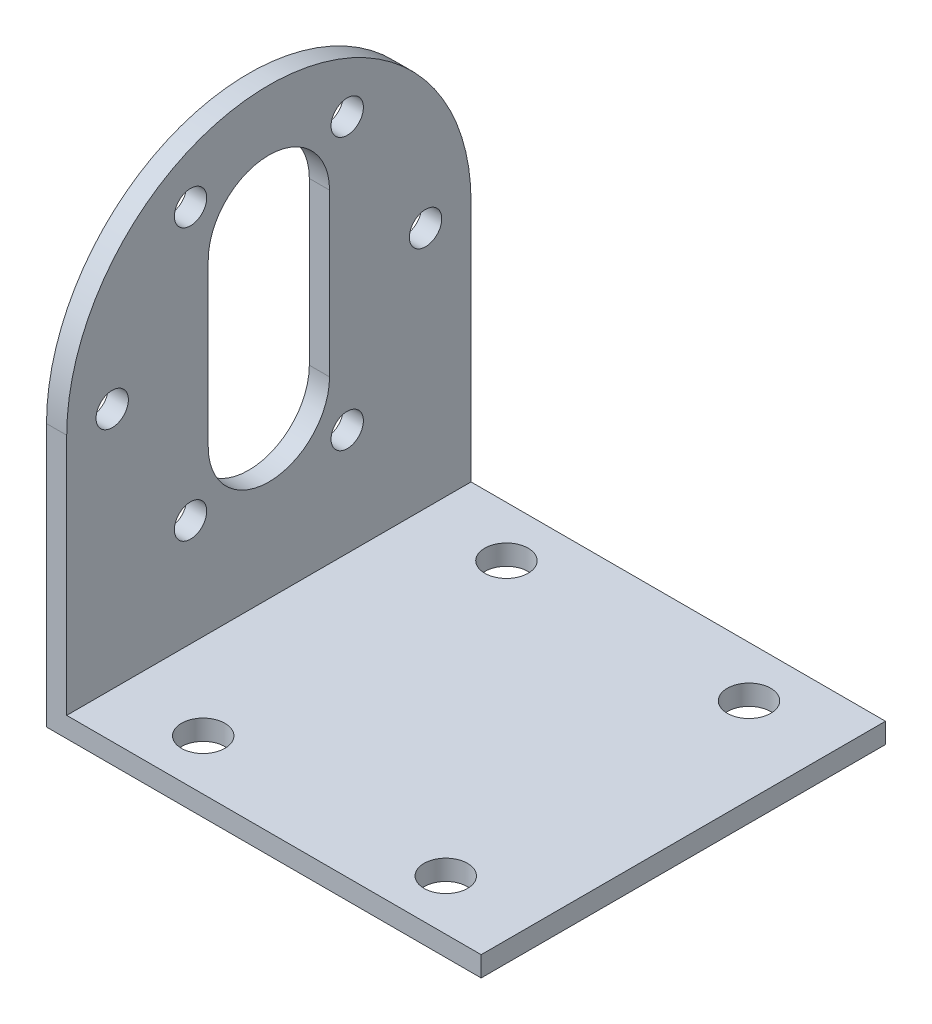
ISO-10303-21;
HEADER;
FILE_DESCRIPTION(('STEP AP214'),'2;1');
FILE_NAME('part.step','',(''),(''),'','','');
FILE_SCHEMA(('AUTOMOTIVE_DESIGN { 1 0 10303 214 1 1 1 1 }'));
ENDSEC;
DATA;
#1=APPLICATION_CONTEXT('core data for automotive mechanical design processes');
#2=APPLICATION_PROTOCOL_DEFINITION('international standard','automotive_design',2000,#1);
#3=PRODUCT_CONTEXT('',#1,'mechanical');
#4=PRODUCT('Part','Part','',(#3));
#5=PRODUCT_RELATED_PRODUCT_CATEGORY('part','',(#4));
#6=PRODUCT_DEFINITION_FORMATION('','',#4);
#7=PRODUCT_DEFINITION_CONTEXT('part definition',#1,'design');
#8=PRODUCT_DEFINITION('design','',#6,#7);
#9=PRODUCT_DEFINITION_SHAPE('','',#8);
#10=(LENGTH_UNIT() NAMED_UNIT(*) SI_UNIT(.MILLI.,.METRE.));
#11=(NAMED_UNIT(*) PLANE_ANGLE_UNIT() SI_UNIT($,.RADIAN.));
#12=(NAMED_UNIT(*) SI_UNIT($,.STERADIAN.) SOLID_ANGLE_UNIT());
#13=UNCERTAINTY_MEASURE_WITH_UNIT(LENGTH_MEASURE(1.E-05),#10,'distance_accuracy_value','');
#14=(GEOMETRIC_REPRESENTATION_CONTEXT(3) GLOBAL_UNCERTAINTY_ASSIGNED_CONTEXT((#13)) GLOBAL_UNIT_ASSIGNED_CONTEXT((#10,
#11,#12)) REPRESENTATION_CONTEXT('',''));
#15=CARTESIAN_POINT('',(0.,0.,0.));
#16=DIRECTION('',(0.,0.,1.));
#17=DIRECTION('',(1.,0.,0.));
#18=AXIS2_PLACEMENT_3D('',#15,#16,#17);
#19=CARTESIAN_POINT('',(0.,2.,0.));
#20=DIRECTION('',(0.,-1.,0.));
#21=DIRECTION('',(0.,0.,-1.));
#22=AXIS2_PLACEMENT_3D('',#19,#20,#21);
#23=PLANE('',#22);
#24=CARTESIAN_POINT('',(-11.,2.,-15.));
#25=DIRECTION('',(0.,1.,0.));
#26=DIRECTION('',(0.,0.,-1.));
#27=AXIS2_PLACEMENT_3D('',#24,#25,#26);
#28=CIRCLE('',#27,2.15);
#29=CARTESIAN_POINT('',(-11.,2.,-17.15));
#30=VERTEX_POINT('',#29);
#31=EDGE_CURVE('E216',#30,#30,#28,.T.);
#32=ORIENTED_EDGE('',*,*,#31,.F.);
#33=EDGE_LOOP('',(#32));
#34=FACE_BOUND('',#33,.T.);
#35=CARTESIAN_POINT('',(13.,2.,-15.));
#36=DIRECTION('',(0.,1.,0.));
#37=DIRECTION('',(0.,0.,1.));
#38=AXIS2_PLACEMENT_3D('',#35,#36,#37);
#39=CIRCLE('',#38,2.15);
#40=CARTESIAN_POINT('',(13.,2.,-12.85));
#41=VERTEX_POINT('',#40);
#42=EDGE_CURVE('E228',#41,#41,#39,.T.);
#43=ORIENTED_EDGE('',*,*,#42,.F.);
#44=EDGE_LOOP('',(#43));
#45=FACE_BOUND('',#44,.T.);
#46=DIRECTION('',(-1.,0.,0.));
#47=VECTOR('',#46,1.);
#48=CARTESIAN_POINT('',(-21.5,2.,-20.));
#49=LINE('',#48,#47);
#50=CARTESIAN_POINT('',(21.5,2.,-20.));
#51=VERTEX_POINT('',#50);
#52=CARTESIAN_POINT('',(-19.5,2.,-20.));
#53=VERTEX_POINT('',#52);
#54=EDGE_CURVE('E52',#51,#53,#49,.T.);
#55=ORIENTED_EDGE('',*,*,#54,.T.);
#56=DIRECTION('',(0.,0.,1.));
#57=VECTOR('',#56,1.);
#58=CARTESIAN_POINT('',(-19.5,2.,0.));
#59=LINE('',#58,#57);
#60=CARTESIAN_POINT('',(-19.5,2.,20.));
#61=VERTEX_POINT('',#60);
#62=EDGE_CURVE('E56',#53,#61,#59,.T.);
#63=ORIENTED_EDGE('',*,*,#62,.T.);
#64=DIRECTION('',(1.,0.,0.));
#65=VECTOR('',#64,1.);
#66=CARTESIAN_POINT('',(-21.5,2.,20.));
#67=LINE('',#66,#65);
#68=CARTESIAN_POINT('',(21.5,2.,20.));
#69=VERTEX_POINT('',#68);
#70=EDGE_CURVE('E238',#61,#69,#67,.T.);
#71=ORIENTED_EDGE('',*,*,#70,.T.);
#72=DIRECTION('',(0.,0.,-1.));
#73=VECTOR('',#72,1.);
#74=CARTESIAN_POINT('',(21.5,2.,20.));
#75=LINE('',#74,#73);
#76=EDGE_CURVE('E234',#69,#51,#75,.T.);
#77=ORIENTED_EDGE('',*,*,#76,.T.);
#78=EDGE_LOOP('',(#55,#63,#71,#77));
#79=FACE_BOUND('',#78,.T.);
#80=CARTESIAN_POINT('',(13.,2.,15.));
#81=DIRECTION('',(0.,1.,0.));
#82=DIRECTION('',(0.,0.,-1.));
#83=AXIS2_PLACEMENT_3D('',#80,#81,#82);
#84=CIRCLE('',#83,2.15);
#85=CARTESIAN_POINT('',(13.,2.,12.85));
#86=VERTEX_POINT('',#85);
#87=EDGE_CURVE('E222',#86,#86,#84,.T.);
#88=ORIENTED_EDGE('',*,*,#87,.F.);
#89=EDGE_LOOP('',(#88));
#90=FACE_BOUND('',#89,.T.);
#91=CARTESIAN_POINT('',(-11.,2.,15.));
#92=DIRECTION('',(0.,1.,0.));
#93=DIRECTION('',(0.,0.,1.));
#94=AXIS2_PLACEMENT_3D('',#91,#92,#93);
#95=CIRCLE('',#94,2.15);
#96=CARTESIAN_POINT('',(-11.,2.,17.15));
#97=VERTEX_POINT('',#96);
#98=EDGE_CURVE('E210',#97,#97,#95,.T.);
#99=ORIENTED_EDGE('',*,*,#98,.F.);
#100=EDGE_LOOP('',(#99));
#101=FACE_BOUND('',#100,.T.);
#102=ADVANCED_FACE('F37',(#34,#45,#79,#90,#101),#23,.F.);
#103=CARTESIAN_POINT('',(0.,0.,0.));
#104=DIRECTION('',(0.,-1.,0.));
#105=DIRECTION('',(0.,0.,-1.));
#106=AXIS2_PLACEMENT_3D('',#103,#104,#105);
#107=PLANE('',#106);
#108=DIRECTION('',(0.,0.,-1.));
#109=VECTOR('',#108,1.);
#110=CARTESIAN_POINT('',(21.5,0.,20.));
#111=LINE('',#110,#109);
#112=CARTESIAN_POINT('',(21.5,0.,20.));
#113=VERTEX_POINT('',#112);
#114=CARTESIAN_POINT('',(21.5,0.,-20.));
#115=VERTEX_POINT('',#114);
#116=EDGE_CURVE('E231',#113,#115,#111,.T.);
#117=ORIENTED_EDGE('',*,*,#116,.F.);
#118=DIRECTION('',(1.,0.,0.));
#119=VECTOR('',#118,1.);
#120=CARTESIAN_POINT('',(-21.5,0.,20.));
#121=LINE('',#120,#119);
#122=CARTESIAN_POINT('',(-21.5,0.,20.));
#123=VERTEX_POINT('',#122);
#124=EDGE_CURVE('E236',#123,#113,#121,.T.);
#125=ORIENTED_EDGE('',*,*,#124,.F.);
#126=DIRECTION('',(0.,0.,1.));
#127=VECTOR('',#126,1.);
#128=CARTESIAN_POINT('',(-21.5,0.,20.));
#129=LINE('',#128,#127);
#130=CARTESIAN_POINT('',(-21.5,0.,-20.));
#131=VERTEX_POINT('',#130);
#132=EDGE_CURVE('E245',#131,#123,#129,.T.);
#133=ORIENTED_EDGE('',*,*,#132,.F.);
#134=DIRECTION('',(-1.,0.,0.));
#135=VECTOR('',#134,1.);
#136=CARTESIAN_POINT('',(-21.5,0.,-20.));
#137=LINE('',#136,#135);
#138=EDGE_CURVE('E243',#115,#131,#137,.T.);
#139=ORIENTED_EDGE('',*,*,#138,.F.);
#140=EDGE_LOOP('',(#117,#125,#133,#139));
#141=FACE_BOUND('',#140,.T.);
#142=CARTESIAN_POINT('',(-11.,0.,-15.));
#143=DIRECTION('',(0.,1.,0.));
#144=DIRECTION('',(0.,0.,-1.));
#145=AXIS2_PLACEMENT_3D('',#142,#143,#144);
#146=CIRCLE('',#145,2.15);
#147=CARTESIAN_POINT('',(-11.,0.,-17.15));
#148=VERTEX_POINT('',#147);
#149=EDGE_CURVE('E213',#148,#148,#146,.T.);
#150=ORIENTED_EDGE('',*,*,#149,.T.);
#151=EDGE_LOOP('',(#150));
#152=FACE_BOUND('',#151,.T.);
#153=CARTESIAN_POINT('',(13.,0.,-15.));
#154=DIRECTION('',(0.,1.,0.));
#155=DIRECTION('',(0.,0.,1.));
#156=AXIS2_PLACEMENT_3D('',#153,#154,#155);
#157=CIRCLE('',#156,2.15);
#158=CARTESIAN_POINT('',(13.,0.,-12.85));
#159=VERTEX_POINT('',#158);
#160=EDGE_CURVE('E225',#159,#159,#157,.T.);
#161=ORIENTED_EDGE('',*,*,#160,.T.);
#162=EDGE_LOOP('',(#161));
#163=FACE_BOUND('',#162,.T.);
#164=CARTESIAN_POINT('',(13.,0.,15.));
#165=DIRECTION('',(0.,1.,0.));
#166=DIRECTION('',(0.,0.,-1.));
#167=AXIS2_PLACEMENT_3D('',#164,#165,#166);
#168=CIRCLE('',#167,2.15);
#169=CARTESIAN_POINT('',(13.,0.,12.85));
#170=VERTEX_POINT('',#169);
#171=EDGE_CURVE('E219',#170,#170,#168,.T.);
#172=ORIENTED_EDGE('',*,*,#171,.T.);
#173=EDGE_LOOP('',(#172));
#174=FACE_BOUND('',#173,.T.);
#175=CARTESIAN_POINT('',(-11.,0.,15.));
#176=DIRECTION('',(0.,1.,0.));
#177=DIRECTION('',(0.,0.,1.));
#178=AXIS2_PLACEMENT_3D('',#175,#176,#177);
#179=CIRCLE('',#178,2.15);
#180=CARTESIAN_POINT('',(-11.,0.,17.15));
#181=VERTEX_POINT('',#180);
#182=EDGE_CURVE('E209',#181,#181,#179,.T.);
#183=ORIENTED_EDGE('',*,*,#182,.T.);
#184=EDGE_LOOP('',(#183));
#185=FACE_BOUND('',#184,.T.);
#186=ADVANCED_FACE('F262',(#141,#152,#163,#174,#185),#107,.T.);
#187=CARTESIAN_POINT('',(21.5,2.,20.));
#188=DIRECTION('',(-1.,0.,0.));
#189=DIRECTION('',(0.,0.,1.));
#190=AXIS2_PLACEMENT_3D('',#187,#188,#189);
#191=PLANE('',#190);
#192=ORIENTED_EDGE('',*,*,#116,.T.);
#193=DIRECTION('',(0.,-1.,0.));
#194=VECTOR('',#193,1.);
#195=CARTESIAN_POINT('',(21.5,2.,-20.));
#196=LINE('',#195,#194);
#197=EDGE_CURVE('E11',#51,#115,#196,.T.);
#198=ORIENTED_EDGE('',*,*,#197,.F.);
#199=ORIENTED_EDGE('',*,*,#76,.F.);
#200=DIRECTION('',(0.,-1.,0.));
#201=VECTOR('',#200,1.);
#202=CARTESIAN_POINT('',(21.5,2.,20.));
#203=LINE('',#202,#201);
#204=EDGE_CURVE('E240',#69,#113,#203,.T.);
#205=ORIENTED_EDGE('',*,*,#204,.T.);
#206=EDGE_LOOP('',(#192,#198,#199,#205));
#207=FACE_BOUND('',#206,.T.);
#208=ADVANCED_FACE('F39',(#207),#191,.F.);
#209=CARTESIAN_POINT('',(-21.5,2.,-20.));
#210=DIRECTION('',(0.,0.,1.));
#211=DIRECTION('',(1.,0.,0.));
#212=AXIS2_PLACEMENT_3D('',#209,#210,#211);
#213=PLANE('',#212);
#214=ORIENTED_EDGE('',*,*,#138,.T.);
#215=DIRECTION('',(0.,-1.,0.));
#216=VECTOR('',#215,1.);
#217=CARTESIAN_POINT('',(-21.5,2.,-20.));
#218=LINE('',#217,#216);
#219=CARTESIAN_POINT('',(-21.5,26.,-20.));
#220=VERTEX_POINT('',#219);
#221=EDGE_CURVE('E45',#220,#131,#218,.T.);
#222=ORIENTED_EDGE('',*,*,#221,.F.);
#223=DIRECTION('',(-1.,0.,0.));
#224=VECTOR('',#223,1.);
#225=CARTESIAN_POINT('',(-19.5,26.,-20.));
#226=LINE('',#225,#224);
#227=CARTESIAN_POINT('',(-19.5,26.,-20.));
#228=VERTEX_POINT('',#227);
#229=EDGE_CURVE('E203',#228,#220,#226,.T.);
#230=ORIENTED_EDGE('',*,*,#229,.F.);
#231=DIRECTION('',(0.,-1.,0.));
#232=VECTOR('',#231,1.);
#233=CARTESIAN_POINT('',(-19.5,0.,-20.));
#234=LINE('',#233,#232);
#235=EDGE_CURVE('E197',#228,#53,#234,.T.);
#236=ORIENTED_EDGE('',*,*,#235,.T.);
#237=ORIENTED_EDGE('',*,*,#54,.F.);
#238=ORIENTED_EDGE('',*,*,#197,.T.);
#239=EDGE_LOOP('',(#214,#222,#230,#236,#237,#238));
#240=FACE_BOUND('',#239,.T.);
#241=ADVANCED_FACE('F277',(#240),#213,.F.);
#242=CARTESIAN_POINT('',(-21.5,2.,20.));
#243=DIRECTION('',(1.,0.,0.));
#244=DIRECTION('',(0.,0.,-1.));
#245=AXIS2_PLACEMENT_3D('',#242,#243,#244);
#246=PLANE('',#245);
#247=ORIENTED_EDGE('',*,*,#132,.T.);
#248=DIRECTION('',(0.,-1.,0.));
#249=VECTOR('',#248,1.);
#250=CARTESIAN_POINT('',(-21.5,2.,20.));
#251=LINE('',#250,#249);
#252=CARTESIAN_POINT('',(-21.5,26.,20.));
#253=VERTEX_POINT('',#252);
#254=EDGE_CURVE('E250',#253,#123,#251,.T.);
#255=ORIENTED_EDGE('',*,*,#254,.F.);
#256=CARTESIAN_POINT('',(-21.5,26.,0.));
#257=DIRECTION('',(-1.,0.,0.));
#258=DIRECTION('',(0.,0.,-1.));
#259=AXIS2_PLACEMENT_3D('',#256,#257,#258);
#260=CIRCLE('',#259,20.);
#261=EDGE_CURVE('E189',#253,#220,#260,.T.);
#262=ORIENTED_EDGE('',*,*,#261,.T.);
#263=ORIENTED_EDGE('',*,*,#221,.T.);
#264=EDGE_LOOP('',(#247,#255,#262,#263));
#265=FACE_BOUND('',#264,.T.);
#266=CARTESIAN_POINT('',(-21.5,26.,-15.5));
#267=DIRECTION('',(-1.,0.,0.));
#268=DIRECTION('',(0.,0.,1.));
#269=AXIS2_PLACEMENT_3D('',#266,#267,#268);
#270=CIRCLE('',#269,1.6);
#271=CARTESIAN_POINT('',(-21.5,26.,-13.9));
#272=VERTEX_POINT('',#271);
#273=EDGE_CURVE('E183',#272,#272,#270,.T.);
#274=ORIENTED_EDGE('',*,*,#273,.F.);
#275=EDGE_LOOP('',(#274));
#276=FACE_BOUND('',#275,.T.);
#277=CARTESIAN_POINT('',(-21.5,39.4233937586588,-7.75000000000001));
#278=DIRECTION('',(-1.,0.,0.));
#279=DIRECTION('',(0.,0.,1.));
#280=AXIS2_PLACEMENT_3D('',#277,#278,#279);
#281=CIRCLE('',#280,1.6);
#282=CARTESIAN_POINT('',(-21.5,39.4233937586588,-6.15000000000001));
#283=VERTEX_POINT('',#282);
#284=EDGE_CURVE('E177',#283,#283,#281,.T.);
#285=ORIENTED_EDGE('',*,*,#284,.F.);
#286=EDGE_LOOP('',(#285));
#287=FACE_BOUND('',#286,.T.);
#288=CARTESIAN_POINT('',(-21.5,39.4233937586588,7.74999999999999));
#289=DIRECTION('',(-1.,0.,0.));
#290=DIRECTION('',(0.,0.,1.));
#291=AXIS2_PLACEMENT_3D('',#288,#289,#290);
#292=CIRCLE('',#291,1.6);
#293=CARTESIAN_POINT('',(-21.5,39.4233937586588,9.34999999999999));
#294=VERTEX_POINT('',#293);
#295=EDGE_CURVE('E171',#294,#294,#292,.T.);
#296=ORIENTED_EDGE('',*,*,#295,.F.);
#297=EDGE_LOOP('',(#296));
#298=FACE_BOUND('',#297,.T.);
#299=CARTESIAN_POINT('',(-21.5,26.,15.5));
#300=DIRECTION('',(-1.,0.,0.));
#301=DIRECTION('',(0.,0.,1.));
#302=AXIS2_PLACEMENT_3D('',#299,#300,#301);
#303=CIRCLE('',#302,1.6);
#304=CARTESIAN_POINT('',(-21.5,26.,17.1));
#305=VERTEX_POINT('',#304);
#306=EDGE_CURVE('E165',#305,#305,#303,.T.);
#307=ORIENTED_EDGE('',*,*,#306,.F.);
#308=EDGE_LOOP('',(#307));
#309=FACE_BOUND('',#308,.T.);
#310=CARTESIAN_POINT('',(-21.5,12.5766062413412,7.75));
#311=DIRECTION('',(-1.,0.,0.));
#312=DIRECTION('',(0.,0.,1.));
#313=AXIS2_PLACEMENT_3D('',#310,#311,#312);
#314=CIRCLE('',#313,1.6);
#315=CARTESIAN_POINT('',(-21.5,12.5766062413412,9.35));
#316=VERTEX_POINT('',#315);
#317=EDGE_CURVE('E159',#316,#316,#314,.T.);
#318=ORIENTED_EDGE('',*,*,#317,.F.);
#319=EDGE_LOOP('',(#318));
#320=FACE_BOUND('',#319,.T.);
#321=CARTESIAN_POINT('',(-21.5,12.5766062413412,-7.75));
#322=DIRECTION('',(-1.,0.,0.));
#323=DIRECTION('',(0.,0.,1.));
#324=AXIS2_PLACEMENT_3D('',#321,#322,#323);
#325=CIRCLE('',#324,1.6);
#326=CARTESIAN_POINT('',(-21.5,12.5766062413412,-6.15));
#327=VERTEX_POINT('',#326);
#328=EDGE_CURVE('E152',#327,#327,#325,.T.);
#329=ORIENTED_EDGE('',*,*,#328,.F.);
#330=EDGE_LOOP('',(#329));
#331=FACE_BOUND('',#330,.T.);
#332=DIRECTION('',(0.,-1.,0.));
#333=VECTOR('',#332,1.);
#334=CARTESIAN_POINT('',(-21.5,18.,-6.));
#335=LINE('',#334,#333);
#336=CARTESIAN_POINT('',(-21.5,34.,-6.));
#337=VERTEX_POINT('',#336);
#338=CARTESIAN_POINT('',(-21.5,18.,-6.));
#339=VERTEX_POINT('',#338);
#340=EDGE_CURVE('E146',#337,#339,#335,.T.);
#341=ORIENTED_EDGE('',*,*,#340,.F.);
#342=CARTESIAN_POINT('',(-21.5,34.,0.));
#343=DIRECTION('',(-1.,0.,0.));
#344=DIRECTION('',(0.,0.,-1.));
#345=AXIS2_PLACEMENT_3D('',#342,#343,#344);
#346=CIRCLE('',#345,6.);
#347=CARTESIAN_POINT('',(-21.5,34.,6.00000000000001));
#348=VERTEX_POINT('',#347);
#349=EDGE_CURVE('E119',#348,#337,#346,.T.);
#350=ORIENTED_EDGE('',*,*,#349,.F.);
#351=DIRECTION('',(0.,1.,0.));
#352=VECTOR('',#351,1.);
#353=CARTESIAN_POINT('',(-21.5,18.,6.00000000000001));
#354=LINE('',#353,#352);
#355=CARTESIAN_POINT('',(-21.5,18.,6.));
#356=VERTEX_POINT('',#355);
#357=EDGE_CURVE('E137',#356,#348,#354,.T.);
#358=ORIENTED_EDGE('',*,*,#357,.F.);
#359=CARTESIAN_POINT('',(-21.5,18.,0.));
#360=DIRECTION('',(-1.,0.,0.));
#361=DIRECTION('',(0.,0.,1.));
#362=AXIS2_PLACEMENT_3D('',#359,#360,#361);
#363=CIRCLE('',#362,6.);
#364=EDGE_CURVE('E140',#339,#356,#363,.T.);
#365=ORIENTED_EDGE('',*,*,#364,.F.);
#366=EDGE_LOOP('',(#341,#350,#358,#365));
#367=FACE_BOUND('',#366,.T.);
#368=ADVANCED_FACE('F255',(#265,#276,#287,#298,#309,#320,#331,#367),#246,.F.);
#369=CARTESIAN_POINT('',(-21.5,2.,20.));
#370=DIRECTION('',(0.,0.,-1.));
#371=DIRECTION('',(-1.,0.,0.));
#372=AXIS2_PLACEMENT_3D('',#369,#370,#371);
#373=PLANE('',#372);
#374=ORIENTED_EDGE('',*,*,#70,.F.);
#375=DIRECTION('',(0.,1.,0.));
#376=VECTOR('',#375,1.);
#377=CARTESIAN_POINT('',(-19.5,26.,20.));
#378=LINE('',#377,#376);
#379=CARTESIAN_POINT('',(-19.5,26.,20.));
#380=VERTEX_POINT('',#379);
#381=EDGE_CURVE('E192',#61,#380,#378,.T.);
#382=ORIENTED_EDGE('',*,*,#381,.T.);
#383=DIRECTION('',(-1.,0.,0.));
#384=VECTOR('',#383,1.);
#385=CARTESIAN_POINT('',(-19.5,26.,20.));
#386=LINE('',#385,#384);
#387=EDGE_CURVE('E200',#380,#253,#386,.T.);
#388=ORIENTED_EDGE('',*,*,#387,.T.);
#389=ORIENTED_EDGE('',*,*,#254,.T.);
#390=ORIENTED_EDGE('',*,*,#124,.T.);
#391=ORIENTED_EDGE('',*,*,#204,.F.);
#392=EDGE_LOOP('',(#374,#382,#388,#389,#390,#391));
#393=FACE_BOUND('',#392,.T.);
#394=ADVANCED_FACE('F266',(#393),#373,.F.);
#395=CARTESIAN_POINT('',(13.,2.,-15.));
#396=DIRECTION('',(0.,-1.,0.));
#397=DIRECTION('',(0.,0.,-1.));
#398=AXIS2_PLACEMENT_3D('',#395,#396,#397);
#399=CYLINDRICAL_SURFACE('',#398,2.15);
#400=ORIENTED_EDGE('',*,*,#42,.T.);
#401=EDGE_LOOP('',(#400));
#402=FACE_BOUND('',#401,.T.);
#403=ORIENTED_EDGE('',*,*,#160,.F.);
#404=EDGE_LOOP('',(#403));
#405=FACE_BOUND('',#404,.T.);
#406=ADVANCED_FACE('F294',(#402,#405),#399,.F.);
#407=CARTESIAN_POINT('',(13.,2.,15.));
#408=DIRECTION('',(0.,-1.,0.));
#409=DIRECTION('',(0.,0.,-1.));
#410=AXIS2_PLACEMENT_3D('',#407,#408,#409);
#411=CYLINDRICAL_SURFACE('',#410,2.15);
#412=ORIENTED_EDGE('',*,*,#87,.T.);
#413=EDGE_LOOP('',(#412));
#414=FACE_BOUND('',#413,.T.);
#415=ORIENTED_EDGE('',*,*,#171,.F.);
#416=EDGE_LOOP('',(#415));
#417=FACE_BOUND('',#416,.T.);
#418=ADVANCED_FACE('F301',(#414,#417),#411,.F.);
#419=CARTESIAN_POINT('',(-11.,2.,-15.));
#420=DIRECTION('',(0.,-1.,0.));
#421=DIRECTION('',(0.,0.,-1.));
#422=AXIS2_PLACEMENT_3D('',#419,#420,#421);
#423=CYLINDRICAL_SURFACE('',#422,2.15);
#424=ORIENTED_EDGE('',*,*,#31,.T.);
#425=EDGE_LOOP('',(#424));
#426=FACE_BOUND('',#425,.T.);
#427=ORIENTED_EDGE('',*,*,#149,.F.);
#428=EDGE_LOOP('',(#427));
#429=FACE_BOUND('',#428,.T.);
#430=ADVANCED_FACE('F306',(#426,#429),#423,.F.);
#431=CARTESIAN_POINT('',(-11.,2.,15.));
#432=DIRECTION('',(0.,-1.,0.));
#433=DIRECTION('',(0.,0.,-1.));
#434=AXIS2_PLACEMENT_3D('',#431,#432,#433);
#435=CYLINDRICAL_SURFACE('',#434,2.15);
#436=ORIENTED_EDGE('',*,*,#98,.T.);
#437=EDGE_LOOP('',(#436));
#438=FACE_BOUND('',#437,.T.);
#439=ORIENTED_EDGE('',*,*,#182,.F.);
#440=EDGE_LOOP('',(#439));
#441=FACE_BOUND('',#440,.T.);
#442=ADVANCED_FACE('F317',(#438,#441),#435,.F.);
#443=CARTESIAN_POINT('',(-19.5,26.,0.));
#444=DIRECTION('',(1.,0.,0.));
#445=DIRECTION('',(0.,0.,-1.));
#446=AXIS2_PLACEMENT_3D('',#443,#444,#445);
#447=PLANE('',#446);
#448=CARTESIAN_POINT('',(-19.5,26.,-15.5));
#449=DIRECTION('',(-1.,0.,0.));
#450=DIRECTION('',(0.,0.,1.));
#451=AXIS2_PLACEMENT_3D('',#448,#449,#450);
#452=CIRCLE('',#451,1.6);
#453=CARTESIAN_POINT('',(-19.5,26.,-13.9));
#454=VERTEX_POINT('',#453);
#455=EDGE_CURVE('E186',#454,#454,#452,.T.);
#456=ORIENTED_EDGE('',*,*,#455,.T.);
#457=EDGE_LOOP('',(#456));
#458=FACE_BOUND('',#457,.T.);
#459=CARTESIAN_POINT('',(-19.5,39.4233937586588,-7.75000000000001));
#460=DIRECTION('',(-1.,0.,0.));
#461=DIRECTION('',(0.,0.,1.));
#462=AXIS2_PLACEMENT_3D('',#459,#460,#461);
#463=CIRCLE('',#462,1.6);
#464=CARTESIAN_POINT('',(-19.5,39.4233937586588,-6.15000000000001));
#465=VERTEX_POINT('',#464);
#466=EDGE_CURVE('E180',#465,#465,#463,.T.);
#467=ORIENTED_EDGE('',*,*,#466,.T.);
#468=EDGE_LOOP('',(#467));
#469=FACE_BOUND('',#468,.T.);
#470=CARTESIAN_POINT('',(-19.5,39.4233937586588,7.74999999999999));
#471=DIRECTION('',(-1.,0.,0.));
#472=DIRECTION('',(0.,0.,1.));
#473=AXIS2_PLACEMENT_3D('',#470,#471,#472);
#474=CIRCLE('',#473,1.6);
#475=CARTESIAN_POINT('',(-19.5,39.4233937586588,9.34999999999999));
#476=VERTEX_POINT('',#475);
#477=EDGE_CURVE('E174',#476,#476,#474,.T.);
#478=ORIENTED_EDGE('',*,*,#477,.T.);
#479=EDGE_LOOP('',(#478));
#480=FACE_BOUND('',#479,.T.);
#481=CARTESIAN_POINT('',(-19.5,26.,15.5));
#482=DIRECTION('',(-1.,0.,0.));
#483=DIRECTION('',(0.,0.,1.));
#484=AXIS2_PLACEMENT_3D('',#481,#482,#483);
#485=CIRCLE('',#484,1.6);
#486=CARTESIAN_POINT('',(-19.5,26.,17.1));
#487=VERTEX_POINT('',#486);
#488=EDGE_CURVE('E168',#487,#487,#485,.T.);
#489=ORIENTED_EDGE('',*,*,#488,.T.);
#490=EDGE_LOOP('',(#489));
#491=FACE_BOUND('',#490,.T.);
#492=CARTESIAN_POINT('',(-19.5,12.5766062413412,7.75));
#493=DIRECTION('',(-1.,0.,0.));
#494=DIRECTION('',(0.,0.,1.));
#495=AXIS2_PLACEMENT_3D('',#492,#493,#494);
#496=CIRCLE('',#495,1.6);
#497=CARTESIAN_POINT('',(-19.5,12.5766062413412,9.35));
#498=VERTEX_POINT('',#497);
#499=EDGE_CURVE('E162',#498,#498,#496,.T.);
#500=ORIENTED_EDGE('',*,*,#499,.T.);
#501=EDGE_LOOP('',(#500));
#502=FACE_BOUND('',#501,.T.);
#503=CARTESIAN_POINT('',(-19.5,12.5766062413412,-7.75));
#504=DIRECTION('',(-1.,0.,0.));
#505=DIRECTION('',(0.,0.,1.));
#506=AXIS2_PLACEMENT_3D('',#503,#504,#505);
#507=CIRCLE('',#506,1.6);
#508=CARTESIAN_POINT('',(-19.5,12.5766062413412,-6.15));
#509=VERTEX_POINT('',#508);
#510=EDGE_CURVE('E156',#509,#509,#507,.T.);
#511=ORIENTED_EDGE('',*,*,#510,.T.);
#512=EDGE_LOOP('',(#511));
#513=FACE_BOUND('',#512,.T.);
#514=CARTESIAN_POINT('',(-19.5,34.,0.));
#515=DIRECTION('',(-1.,0.,0.));
#516=DIRECTION('',(0.,0.,-1.));
#517=AXIS2_PLACEMENT_3D('',#514,#515,#516);
#518=CIRCLE('',#517,6.);
#519=CARTESIAN_POINT('',(-19.5,34.,6.00000000000001));
#520=VERTEX_POINT('',#519);
#521=CARTESIAN_POINT('',(-19.5,34.,-6.));
#522=VERTEX_POINT('',#521);
#523=EDGE_CURVE('E116',#520,#522,#518,.T.);
#524=ORIENTED_EDGE('',*,*,#523,.T.);
#525=DIRECTION('',(0.,-1.,0.));
#526=VECTOR('',#525,1.);
#527=CARTESIAN_POINT('',(-19.5,18.,-6.));
#528=LINE('',#527,#526);
#529=CARTESIAN_POINT('',(-19.5,18.,-6.));
#530=VERTEX_POINT('',#529);
#531=EDGE_CURVE('E128',#522,#530,#528,.T.);
#532=ORIENTED_EDGE('',*,*,#531,.T.);
#533=CARTESIAN_POINT('',(-19.5,18.,0.));
#534=DIRECTION('',(-1.,0.,0.));
#535=DIRECTION('',(0.,0.,1.));
#536=AXIS2_PLACEMENT_3D('',#533,#534,#535);
#537=CIRCLE('',#536,6.);
#538=CARTESIAN_POINT('',(-19.5,18.,6.));
#539=VERTEX_POINT('',#538);
#540=EDGE_CURVE('E132',#530,#539,#537,.T.);
#541=ORIENTED_EDGE('',*,*,#540,.T.);
#542=DIRECTION('',(0.,1.,0.));
#543=VECTOR('',#542,1.);
#544=CARTESIAN_POINT('',(-19.5,18.,6.00000000000001));
#545=LINE('',#544,#543);
#546=EDGE_CURVE('E124',#539,#520,#545,.T.);
#547=ORIENTED_EDGE('',*,*,#546,.T.);
#548=EDGE_LOOP('',(#524,#532,#541,#547));
#549=FACE_BOUND('',#548,.T.);
#550=ORIENTED_EDGE('',*,*,#62,.F.);
#551=ORIENTED_EDGE('',*,*,#235,.F.);
#552=CARTESIAN_POINT('',(-19.5,26.,0.));
#553=DIRECTION('',(-1.,0.,0.));
#554=DIRECTION('',(0.,0.,-1.));
#555=AXIS2_PLACEMENT_3D('',#552,#553,#554);
#556=CIRCLE('',#555,20.);
#557=EDGE_CURVE('E194',#380,#228,#556,.T.);
#558=ORIENTED_EDGE('',*,*,#557,.F.);
#559=ORIENTED_EDGE('',*,*,#381,.F.);
#560=EDGE_LOOP('',(#550,#551,#558,#559));
#561=FACE_BOUND('',#560,.T.);
#562=ADVANCED_FACE('F134',(#458,#469,#480,#491,#502,#513,#549,#561),#447,.T.);
#563=CARTESIAN_POINT('',(-19.5,26.,0.));
#564=DIRECTION('',(-1.,0.,0.));
#565=DIRECTION('',(0.,0.,1.));
#566=AXIS2_PLACEMENT_3D('',#563,#564,#565);
#567=CYLINDRICAL_SURFACE('',#566,20.);
#568=ORIENTED_EDGE('',*,*,#261,.F.);
#569=ORIENTED_EDGE('',*,*,#387,.F.);
#570=ORIENTED_EDGE('',*,*,#557,.T.);
#571=ORIENTED_EDGE('',*,*,#229,.T.);
#572=EDGE_LOOP('',(#568,#569,#570,#571));
#573=FACE_BOUND('',#572,.T.);
#574=ADVANCED_FACE('F276',(#573),#567,.T.);
#575=CARTESIAN_POINT('',(-19.5,26.,-15.5));
#576=DIRECTION('',(-1.,0.,0.));
#577=DIRECTION('',(0.,0.,1.));
#578=AXIS2_PLACEMENT_3D('',#575,#576,#577);
#579=CYLINDRICAL_SURFACE('',#578,1.6);
#580=ORIENTED_EDGE('',*,*,#455,.F.);
#581=EDGE_LOOP('',(#580));
#582=FACE_BOUND('',#581,.T.);
#583=ORIENTED_EDGE('',*,*,#273,.T.);
#584=EDGE_LOOP('',(#583));
#585=FACE_BOUND('',#584,.T.);
#586=ADVANCED_FACE('F331',(#582,#585),#579,.F.);
#587=CARTESIAN_POINT('',(-19.5,39.4233937586588,-7.75000000000001));
#588=DIRECTION('',(-1.,0.,0.));
#589=DIRECTION('',(0.,0.,1.));
#590=AXIS2_PLACEMENT_3D('',#587,#588,#589);
#591=CYLINDRICAL_SURFACE('',#590,1.6);
#592=ORIENTED_EDGE('',*,*,#466,.F.);
#593=EDGE_LOOP('',(#592));
#594=FACE_BOUND('',#593,.T.);
#595=ORIENTED_EDGE('',*,*,#284,.T.);
#596=EDGE_LOOP('',(#595));
#597=FACE_BOUND('',#596,.T.);
#598=ADVANCED_FACE('F335',(#594,#597),#591,.F.);
#599=CARTESIAN_POINT('',(-19.5,39.4233937586588,7.74999999999999));
#600=DIRECTION('',(-1.,0.,0.));
#601=DIRECTION('',(0.,0.,1.));
#602=AXIS2_PLACEMENT_3D('',#599,#600,#601);
#603=CYLINDRICAL_SURFACE('',#602,1.6);
#604=ORIENTED_EDGE('',*,*,#477,.F.);
#605=EDGE_LOOP('',(#604));
#606=FACE_BOUND('',#605,.T.);
#607=ORIENTED_EDGE('',*,*,#295,.T.);
#608=EDGE_LOOP('',(#607));
#609=FACE_BOUND('',#608,.T.);
#610=ADVANCED_FACE('F339',(#606,#609),#603,.F.);
#611=CARTESIAN_POINT('',(-19.5,26.,15.5));
#612=DIRECTION('',(-1.,0.,0.));
#613=DIRECTION('',(0.,0.,1.));
#614=AXIS2_PLACEMENT_3D('',#611,#612,#613);
#615=CYLINDRICAL_SURFACE('',#614,1.6);
#616=ORIENTED_EDGE('',*,*,#488,.F.);
#617=EDGE_LOOP('',(#616));
#618=FACE_BOUND('',#617,.T.);
#619=ORIENTED_EDGE('',*,*,#306,.T.);
#620=EDGE_LOOP('',(#619));
#621=FACE_BOUND('',#620,.T.);
#622=ADVANCED_FACE('F343',(#618,#621),#615,.F.);
#623=CARTESIAN_POINT('',(-19.5,12.5766062413412,7.75));
#624=DIRECTION('',(-1.,0.,0.));
#625=DIRECTION('',(0.,0.,1.));
#626=AXIS2_PLACEMENT_3D('',#623,#624,#625);
#627=CYLINDRICAL_SURFACE('',#626,1.6);
#628=ORIENTED_EDGE('',*,*,#499,.F.);
#629=EDGE_LOOP('',(#628));
#630=FACE_BOUND('',#629,.T.);
#631=ORIENTED_EDGE('',*,*,#317,.T.);
#632=EDGE_LOOP('',(#631));
#633=FACE_BOUND('',#632,.T.);
#634=ADVANCED_FACE('F347',(#630,#633),#627,.F.);
#635=CARTESIAN_POINT('',(-19.5,12.5766062413412,-7.75));
#636=DIRECTION('',(-1.,0.,0.));
#637=DIRECTION('',(0.,0.,1.));
#638=AXIS2_PLACEMENT_3D('',#635,#636,#637);
#639=CYLINDRICAL_SURFACE('',#638,1.6);
#640=ORIENTED_EDGE('',*,*,#510,.F.);
#641=EDGE_LOOP('',(#640));
#642=FACE_BOUND('',#641,.T.);
#643=ORIENTED_EDGE('',*,*,#328,.T.);
#644=EDGE_LOOP('',(#643));
#645=FACE_BOUND('',#644,.T.);
#646=ADVANCED_FACE('F351',(#642,#645),#639,.F.);
#647=CARTESIAN_POINT('',(-19.5,34.,0.));
#648=DIRECTION('',(-1.,0.,0.));
#649=DIRECTION('',(0.,0.,1.));
#650=AXIS2_PLACEMENT_3D('',#647,#648,#649);
#651=CYLINDRICAL_SURFACE('',#650,6.);
#652=ORIENTED_EDGE('',*,*,#349,.T.);
#653=DIRECTION('',(-1.,0.,0.));
#654=VECTOR('',#653,1.);
#655=CARTESIAN_POINT('',(-19.5,34.,-6.));
#656=LINE('',#655,#654);
#657=EDGE_CURVE('E112',#522,#337,#656,.T.);
#658=ORIENTED_EDGE('',*,*,#657,.F.);
#659=ORIENTED_EDGE('',*,*,#523,.F.);
#660=DIRECTION('',(-1.,0.,0.));
#661=VECTOR('',#660,1.);
#662=CARTESIAN_POINT('',(-19.5,34.,6.00000000000001));
#663=LINE('',#662,#661);
#664=EDGE_CURVE('E150',#520,#348,#663,.T.);
#665=ORIENTED_EDGE('',*,*,#664,.T.);
#666=EDGE_LOOP('',(#652,#658,#659,#665));
#667=FACE_BOUND('',#666,.T.);
#668=ADVANCED_FACE('F114',(#667),#651,.F.);
#669=CARTESIAN_POINT('',(-19.5,18.,6.00000000000001));
#670=DIRECTION('',(0.,0.,1.));
#671=DIRECTION('',(0.,-1.,0.));
#672=AXIS2_PLACEMENT_3D('',#669,#670,#671);
#673=PLANE('',#672);
#674=ORIENTED_EDGE('',*,*,#357,.T.);
#675=ORIENTED_EDGE('',*,*,#664,.F.);
#676=ORIENTED_EDGE('',*,*,#546,.F.);
#677=DIRECTION('',(-1.,0.,0.));
#678=VECTOR('',#677,1.);
#679=CARTESIAN_POINT('',(-19.5,18.,6.));
#680=LINE('',#679,#678);
#681=EDGE_CURVE('E153',#539,#356,#680,.T.);
#682=ORIENTED_EDGE('',*,*,#681,.T.);
#683=EDGE_LOOP('',(#674,#675,#676,#682));
#684=FACE_BOUND('',#683,.T.);
#685=ADVANCED_FACE('F358',(#684),#673,.F.);
#686=CARTESIAN_POINT('',(-19.5,18.,0.));
#687=DIRECTION('',(-1.,0.,0.));
#688=DIRECTION('',(0.,0.,1.));
#689=AXIS2_PLACEMENT_3D('',#686,#687,#688);
#690=CYLINDRICAL_SURFACE('',#689,6.);
#691=ORIENTED_EDGE('',*,*,#364,.T.);
#692=ORIENTED_EDGE('',*,*,#681,.F.);
#693=ORIENTED_EDGE('',*,*,#540,.F.);
#694=DIRECTION('',(-1.,0.,0.));
#695=VECTOR('',#694,1.);
#696=CARTESIAN_POINT('',(-19.5,18.,-6.));
#697=LINE('',#696,#695);
#698=EDGE_CURVE('E123',#530,#339,#697,.T.);
#699=ORIENTED_EDGE('',*,*,#698,.T.);
#700=EDGE_LOOP('',(#691,#692,#693,#699));
#701=FACE_BOUND('',#700,.T.);
#702=ADVANCED_FACE('F361',(#701),#690,.F.);
#703=CARTESIAN_POINT('',(-19.5,18.,-6.));
#704=DIRECTION('',(0.,0.,-1.));
#705=DIRECTION('',(0.,1.,0.));
#706=AXIS2_PLACEMENT_3D('',#703,#704,#705);
#707=PLANE('',#706);
#708=ORIENTED_EDGE('',*,*,#340,.T.);
#709=ORIENTED_EDGE('',*,*,#698,.F.);
#710=ORIENTED_EDGE('',*,*,#531,.F.);
#711=ORIENTED_EDGE('',*,*,#657,.T.);
#712=EDGE_LOOP('',(#708,#709,#710,#711));
#713=FACE_BOUND('',#712,.T.);
#714=ADVANCED_FACE('F129',(#713),#707,.F.);
#715=CLOSED_SHELL('',(#102,#186,#208,#241,#368,#394,#406,#418,#430,#442,#562,#574,#586,#598,
#610,#622,#634,#646,#668,#685,#702,#714));
#716=MANIFOLD_SOLID_BREP('B2',#715);
#717=ADVANCED_BREP_SHAPE_REPRESENTATION('',(#18,#716),#14);
#718=SHAPE_DEFINITION_REPRESENTATION(#9,#717);
ENDSEC;
END-ISO-10303-21;
